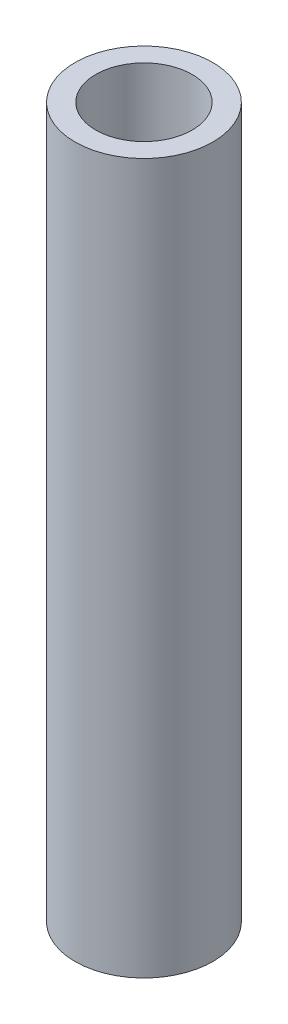
ISO-10303-21;
HEADER;
FILE_DESCRIPTION(('STEP AP214'),'2;1');
FILE_NAME('part.step','',(''),(''),'','','');
FILE_SCHEMA(('AUTOMOTIVE_DESIGN { 1 0 10303 214 1 1 1 1 }'));
ENDSEC;
DATA;
#1=APPLICATION_CONTEXT('core data for automotive mechanical design processes');
#2=APPLICATION_PROTOCOL_DEFINITION('international standard','automotive_design',2000,#1);
#3=PRODUCT_CONTEXT('',#1,'mechanical');
#4=PRODUCT('Part','Part','',(#3));
#5=PRODUCT_RELATED_PRODUCT_CATEGORY('part','',(#4));
#6=PRODUCT_DEFINITION_FORMATION('','',#4);
#7=PRODUCT_DEFINITION_CONTEXT('part definition',#1,'design');
#8=PRODUCT_DEFINITION('design','',#6,#7);
#9=PRODUCT_DEFINITION_SHAPE('','',#8);
#10=(LENGTH_UNIT() NAMED_UNIT(*) SI_UNIT(.MILLI.,.METRE.));
#11=(NAMED_UNIT(*) PLANE_ANGLE_UNIT() SI_UNIT($,.RADIAN.));
#12=(NAMED_UNIT(*) SI_UNIT($,.STERADIAN.) SOLID_ANGLE_UNIT());
#13=UNCERTAINTY_MEASURE_WITH_UNIT(LENGTH_MEASURE(1.E-05),#10,'distance_accuracy_value','');
#14=(GEOMETRIC_REPRESENTATION_CONTEXT(3) GLOBAL_UNCERTAINTY_ASSIGNED_CONTEXT((#13)) GLOBAL_UNIT_ASSIGNED_CONTEXT((#10,
#11,#12)) REPRESENTATION_CONTEXT('',''));
#15=CARTESIAN_POINT('',(0.,0.,0.));
#16=DIRECTION('',(0.,0.,1.));
#17=DIRECTION('',(1.,0.,0.));
#18=AXIS2_PLACEMENT_3D('',#15,#16,#17);
#19=CARTESIAN_POINT('',(0.,3.,0.));
#20=DIRECTION('',(0.,-1.,0.));
#21=DIRECTION('',(0.,0.,-1.));
#22=AXIS2_PLACEMENT_3D('',#19,#20,#21);
#23=CYLINDRICAL_SURFACE('',#22,10.);
#24=CARTESIAN_POINT('',(0.,0.,0.));
#25=DIRECTION('',(0.,1.,0.));
#26=DIRECTION('',(0.,0.,1.));
#27=AXIS2_PLACEMENT_3D('',#24,#25,#26);
#28=CIRCLE('',#27,10.);
#29=CARTESIAN_POINT('',(0.,0.,10.));
#30=VERTEX_POINT('',#29);
#31=EDGE_CURVE('E44',#30,#30,#28,.T.);
#32=ORIENTED_EDGE('',*,*,#31,.T.);
#33=EDGE_LOOP('',(#32));
#34=FACE_BOUND('',#33,.T.);
#35=CARTESIAN_POINT('',(0.,103.,0.));
#36=DIRECTION('',(0.,1.,0.));
#37=DIRECTION('',(0.,0.,1.));
#38=AXIS2_PLACEMENT_3D('',#35,#36,#37);
#39=CIRCLE('',#38,10.);
#40=CARTESIAN_POINT('',(0.,103.,10.));
#41=VERTEX_POINT('',#40);
#42=EDGE_CURVE('E49',#41,#41,#39,.T.);
#43=ORIENTED_EDGE('',*,*,#42,.F.);
#44=EDGE_LOOP('',(#43));
#45=FACE_BOUND('',#44,.T.);
#46=ADVANCED_FACE('F37',(#34,#45),#23,.T.);
#47=CARTESIAN_POINT('',(0.,0.,0.));
#48=DIRECTION('',(0.,1.,0.));
#49=DIRECTION('',(0.,0.,1.));
#50=AXIS2_PLACEMENT_3D('',#47,#48,#49);
#51=PLANE('',#50);
#52=ORIENTED_EDGE('',*,*,#31,.F.);
#53=EDGE_LOOP('',(#52));
#54=FACE_BOUND('',#53,.T.);
#55=ADVANCED_FACE('F65',(#54),#51,.F.);
#56=CARTESIAN_POINT('',(0.,103.,0.));
#57=DIRECTION('',(0.,1.,0.));
#58=DIRECTION('',(0.,0.,1.));
#59=AXIS2_PLACEMENT_3D('',#56,#57,#58);
#60=PLANE('',#59);
#61=ORIENTED_EDGE('',*,*,#42,.T.);
#62=EDGE_LOOP('',(#61));
#63=FACE_BOUND('',#62,.T.);
#64=CARTESIAN_POINT('',(0.,103.,0.));
#65=DIRECTION('',(0.,1.,0.));
#66=DIRECTION('',(0.,0.,1.));
#67=AXIS2_PLACEMENT_3D('',#64,#65,#66);
#68=CIRCLE('',#67,7.);
#69=CARTESIAN_POINT('',(0.,103.,7.));
#70=VERTEX_POINT('',#69);
#71=EDGE_CURVE('E54',#70,#70,#68,.T.);
#72=ORIENTED_EDGE('',*,*,#71,.F.);
#73=EDGE_LOOP('',(#72));
#74=FACE_BOUND('',#73,.T.);
#75=ADVANCED_FACE('F63',(#63,#74),#60,.T.);
#76=CARTESIAN_POINT('',(0.,103.,0.));
#77=DIRECTION('',(0.,-1.,0.));
#78=DIRECTION('',(0.,0.,-1.));
#79=AXIS2_PLACEMENT_3D('',#76,#77,#78);
#80=CYLINDRICAL_SURFACE('',#79,7.);
#81=ORIENTED_EDGE('',*,*,#71,.T.);
#82=EDGE_LOOP('',(#81));
#83=FACE_BOUND('',#82,.T.);
#84=CARTESIAN_POINT('',(0.,3.,0.));
#85=DIRECTION('',(0.,1.,0.));
#86=DIRECTION('',(0.,0.,1.));
#87=AXIS2_PLACEMENT_3D('',#84,#85,#86);
#88=CIRCLE('',#87,7.);
#89=CARTESIAN_POINT('',(0.,3.,7.));
#90=VERTEX_POINT('',#89);
#91=EDGE_CURVE('E10',#90,#90,#88,.F.);
#92=ORIENTED_EDGE('',*,*,#91,.T.);
#93=EDGE_LOOP('',(#92));
#94=FACE_BOUND('',#93,.T.);
#95=ADVANCED_FACE('F61',(#83,#94),#80,.F.);
#96=CARTESIAN_POINT('',(0.,3.,0.));
#97=DIRECTION('',(0.,1.,0.));
#98=DIRECTION('',(0.,0.,1.));
#99=AXIS2_PLACEMENT_3D('',#96,#97,#98);
#100=PLANE('',#99);
#101=ORIENTED_EDGE('',*,*,#91,.F.);
#102=EDGE_LOOP('',(#101));
#103=FACE_BOUND('',#102,.T.);
#104=ADVANCED_FACE('F72',(#103),#100,.T.);
#105=CLOSED_SHELL('',(#46,#55,#75,#95,#104));
#106=MANIFOLD_SOLID_BREP('B2',#105);
#107=ADVANCED_BREP_SHAPE_REPRESENTATION('',(#18,#106),#14);
#108=SHAPE_DEFINITION_REPRESENTATION(#9,#107);
ENDSEC;
END-ISO-10303-21;
